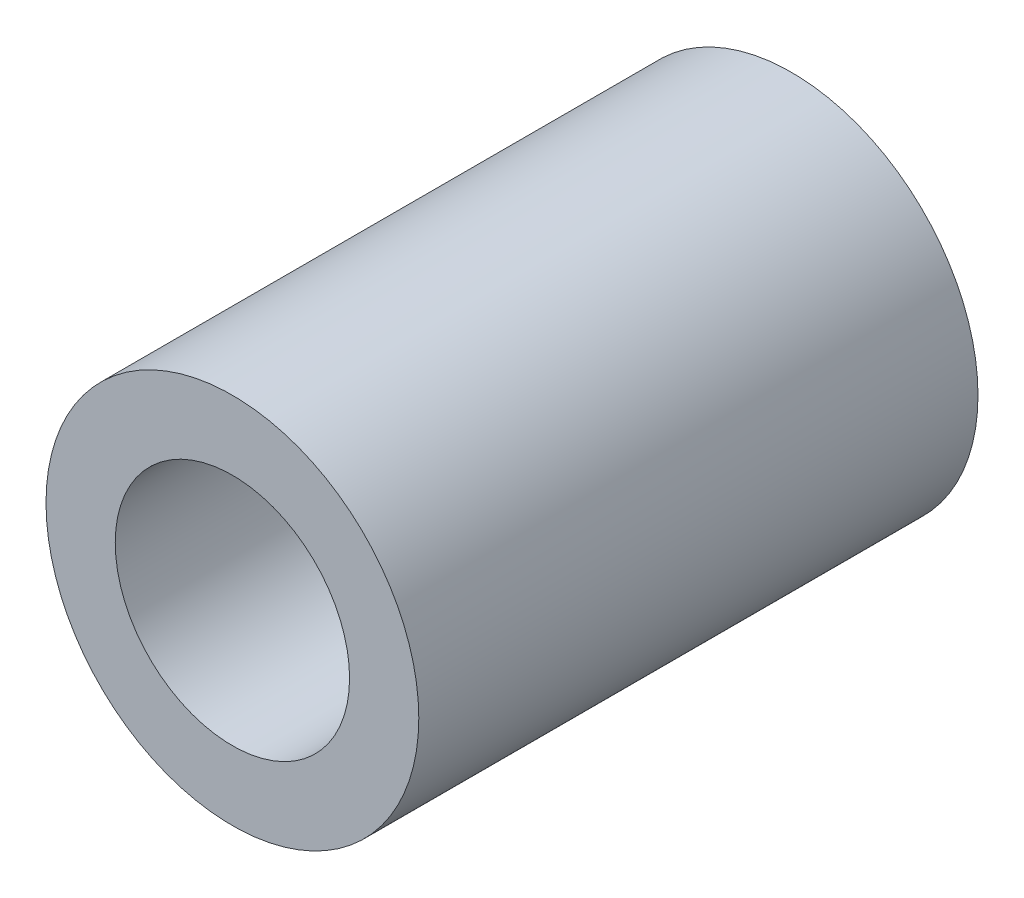
ISO-10303-21;
HEADER;
FILE_DESCRIPTION(('STEP AP214'),'2;1');
FILE_NAME('part.step','',(''),(''),'','','');
FILE_SCHEMA(('AUTOMOTIVE_DESIGN { 1 0 10303 214 1 1 1 1 }'));
ENDSEC;
DATA;
#1=APPLICATION_CONTEXT('core data for automotive mechanical design processes');
#2=APPLICATION_PROTOCOL_DEFINITION('international standard','automotive_design',2000,#1);
#3=PRODUCT_CONTEXT('',#1,'mechanical');
#4=PRODUCT('Part','Part','',(#3));
#5=PRODUCT_RELATED_PRODUCT_CATEGORY('part','',(#4));
#6=PRODUCT_DEFINITION_FORMATION('','',#4);
#7=PRODUCT_DEFINITION_CONTEXT('part definition',#1,'design');
#8=PRODUCT_DEFINITION('design','',#6,#7);
#9=PRODUCT_DEFINITION_SHAPE('','',#8);
#10=(LENGTH_UNIT() NAMED_UNIT(*) SI_UNIT(.MILLI.,.METRE.));
#11=(NAMED_UNIT(*) PLANE_ANGLE_UNIT() SI_UNIT($,.RADIAN.));
#12=(NAMED_UNIT(*) SI_UNIT($,.STERADIAN.) SOLID_ANGLE_UNIT());
#13=UNCERTAINTY_MEASURE_WITH_UNIT(LENGTH_MEASURE(1.E-05),#10,'distance_accuracy_value','');
#14=(GEOMETRIC_REPRESENTATION_CONTEXT(3) GLOBAL_UNCERTAINTY_ASSIGNED_CONTEXT((#13)) GLOBAL_UNIT_ASSIGNED_CONTEXT((#10,
#11,#12)) REPRESENTATION_CONTEXT('',''));
#15=CARTESIAN_POINT('',(0.,0.,0.));
#16=DIRECTION('',(0.,0.,1.));
#17=DIRECTION('',(1.,0.,0.));
#18=AXIS2_PLACEMENT_3D('',#15,#16,#17);
#19=CARTESIAN_POINT('',(0.,0.,21.));
#20=DIRECTION('',(0.,0.,1.));
#21=DIRECTION('',(1.,0.,0.));
#22=AXIS2_PLACEMENT_3D('',#19,#20,#21);
#23=PLANE('',#22);
#24=CARTESIAN_POINT('',(0.,0.,21.));
#25=DIRECTION('',(0.,0.,1.));
#26=DIRECTION('',(1.,0.,0.));
#27=AXIS2_PLACEMENT_3D('',#24,#25,#26);
#28=CIRCLE('',#27,7.);
#29=CARTESIAN_POINT('',(-7.,0.,21.));
#30=VERTEX_POINT('',#29);
#31=EDGE_CURVE('E10',#30,#30,#28,.T.);
#32=ORIENTED_EDGE('',*,*,#31,.T.);
#33=EDGE_LOOP('',(#32));
#34=FACE_BOUND('',#33,.T.);
#35=CARTESIAN_POINT('',(0.,0.,21.));
#36=DIRECTION('',(0.,0.,1.));
#37=DIRECTION('',(1.,0.,0.));
#38=AXIS2_PLACEMENT_3D('',#35,#36,#37);
#39=CIRCLE('',#38,4.4);
#40=CARTESIAN_POINT('',(-4.4,0.,21.));
#41=VERTEX_POINT('',#40);
#42=EDGE_CURVE('E43',#41,#41,#39,.T.);
#43=ORIENTED_EDGE('',*,*,#42,.F.);
#44=EDGE_LOOP('',(#43));
#45=FACE_BOUND('',#44,.T.);
#46=ADVANCED_FACE('F32',(#34,#45),#23,.T.);
#47=CARTESIAN_POINT('',(0.,0.,0.));
#48=DIRECTION('',(0.,0.,1.));
#49=DIRECTION('',(1.,0.,0.));
#50=AXIS2_PLACEMENT_3D('',#47,#48,#49);
#51=PLANE('',#50);
#52=CARTESIAN_POINT('',(0.,0.,0.));
#53=DIRECTION('',(0.,0.,1.));
#54=DIRECTION('',(1.,0.,0.));
#55=AXIS2_PLACEMENT_3D('',#52,#53,#54);
#56=CIRCLE('',#55,7.);
#57=CARTESIAN_POINT('',(-7.,0.,0.));
#58=VERTEX_POINT('',#57);
#59=EDGE_CURVE('E36',#58,#58,#56,.T.);
#60=ORIENTED_EDGE('',*,*,#59,.F.);
#61=EDGE_LOOP('',(#60));
#62=FACE_BOUND('',#61,.T.);
#63=CARTESIAN_POINT('',(0.,0.,0.));
#64=DIRECTION('',(0.,0.,1.));
#65=DIRECTION('',(1.,0.,0.));
#66=AXIS2_PLACEMENT_3D('',#63,#64,#65);
#67=CIRCLE('',#66,4.4);
#68=CARTESIAN_POINT('',(-4.4,0.,0.));
#69=VERTEX_POINT('',#68);
#70=EDGE_CURVE('E45',#69,#69,#67,.T.);
#71=ORIENTED_EDGE('',*,*,#70,.T.);
#72=EDGE_LOOP('',(#71));
#73=FACE_BOUND('',#72,.T.);
#74=ADVANCED_FACE('F55',(#62,#73),#51,.F.);
#75=CARTESIAN_POINT('',(0.,0.,21.));
#76=DIRECTION('',(0.,0.,-1.));
#77=DIRECTION('',(-1.,0.,0.));
#78=AXIS2_PLACEMENT_3D('',#75,#76,#77);
#79=CYLINDRICAL_SURFACE('',#78,7.);
#80=CARTESIAN_POINT('',(-7.,0.,21.));
#81=CARTESIAN_POINT('',(-7.,0.,20.78125));
#82=CARTESIAN_POINT('',(-7.,0.,20.5625));
#83=CARTESIAN_POINT('',(-7.,0.,20.125));
#84=CARTESIAN_POINT('',(-7.,0.,19.90625));
#85=CARTESIAN_POINT('',(-7.,0.,19.46875));
#86=CARTESIAN_POINT('',(-7.,0.,19.25));
#87=CARTESIAN_POINT('',(-7.,0.,18.8125));
#88=CARTESIAN_POINT('',(-7.,0.,18.59375));
#89=CARTESIAN_POINT('',(-7.,0.,18.15625));
#90=CARTESIAN_POINT('',(-7.,0.,17.9375));
#91=CARTESIAN_POINT('',(-7.,0.,17.5));
#92=CARTESIAN_POINT('',(-7.,0.,17.28125));
#93=CARTESIAN_POINT('',(-7.,0.,16.84375));
#94=CARTESIAN_POINT('',(-7.,0.,16.625));
#95=CARTESIAN_POINT('',(-7.,0.,16.1875));
#96=CARTESIAN_POINT('',(-7.,0.,15.96875));
#97=CARTESIAN_POINT('',(-7.,0.,15.53125));
#98=CARTESIAN_POINT('',(-7.,0.,15.3125));
#99=CARTESIAN_POINT('',(-7.,0.,14.875));
#100=CARTESIAN_POINT('',(-7.,0.,14.65625));
#101=CARTESIAN_POINT('',(-7.,0.,14.21875));
#102=CARTESIAN_POINT('',(-7.,0.,14.));
#103=CARTESIAN_POINT('',(-7.,0.,13.5625));
#104=CARTESIAN_POINT('',(-7.,0.,13.34375));
#105=CARTESIAN_POINT('',(-7.,0.,12.90625));
#106=CARTESIAN_POINT('',(-7.,0.,12.6875));
#107=CARTESIAN_POINT('',(-7.,0.,12.25));
#108=CARTESIAN_POINT('',(-7.,0.,12.03125));
#109=CARTESIAN_POINT('',(-7.,0.,11.59375));
#110=CARTESIAN_POINT('',(-7.,0.,11.375));
#111=CARTESIAN_POINT('',(-7.,0.,10.9375));
#112=CARTESIAN_POINT('',(-7.,0.,10.71875));
#113=CARTESIAN_POINT('',(-7.,0.,10.28125));
#114=CARTESIAN_POINT('',(-7.,0.,10.0625));
#115=CARTESIAN_POINT('',(-7.,0.,9.625));
#116=CARTESIAN_POINT('',(-7.,0.,9.40625));
#117=CARTESIAN_POINT('',(-7.,0.,8.96875));
#118=CARTESIAN_POINT('',(-7.,0.,8.75));
#119=CARTESIAN_POINT('',(-7.,0.,8.3125));
#120=CARTESIAN_POINT('',(-7.,0.,8.09375));
#121=CARTESIAN_POINT('',(-7.,0.,7.65625));
#122=CARTESIAN_POINT('',(-7.,0.,7.4375));
#123=CARTESIAN_POINT('',(-7.,0.,7.));
#124=CARTESIAN_POINT('',(-7.,0.,6.78125));
#125=CARTESIAN_POINT('',(-7.,0.,6.34375));
#126=CARTESIAN_POINT('',(-7.,0.,6.125));
#127=CARTESIAN_POINT('',(-7.,0.,5.6875));
#128=CARTESIAN_POINT('',(-7.,0.,5.46875));
#129=CARTESIAN_POINT('',(-7.,0.,5.03125));
#130=CARTESIAN_POINT('',(-7.,0.,4.8125));
#131=CARTESIAN_POINT('',(-7.,0.,4.375));
#132=CARTESIAN_POINT('',(-7.,0.,4.15625));
#133=CARTESIAN_POINT('',(-7.,0.,3.71875));
#134=CARTESIAN_POINT('',(-7.,0.,3.5));
#135=CARTESIAN_POINT('',(-7.,0.,3.0625));
#136=CARTESIAN_POINT('',(-7.,0.,2.84375));
#137=CARTESIAN_POINT('',(-7.,0.,2.40625));
#138=CARTESIAN_POINT('',(-7.,0.,2.1875));
#139=CARTESIAN_POINT('',(-7.,0.,1.75));
#140=CARTESIAN_POINT('',(-7.,0.,1.53125));
#141=CARTESIAN_POINT('',(-7.,0.,1.09375));
#142=CARTESIAN_POINT('',(-7.,0.,0.875000000000001));
#143=CARTESIAN_POINT('',(-7.,0.,0.4375));
#144=CARTESIAN_POINT('',(-7.,0.,0.21875));
#145=CARTESIAN_POINT('',(-7.,0.,0.));
#146=B_SPLINE_CURVE_WITH_KNOTS('',3,(#80,#81,#82,#83,#84,#85,#86,#87,#88,#89,#90,#91,#92,#93,
#94,#95,#96,#97,#98,#99,#100,#101,#102,#103,#104,#105,#106,#107,#108,#109,#110,#111,#112,#113,
#114,#115,#116,#117,#118,#119,#120,#121,#122,#123,#124,#125,#126,#127,#128,#129,#130,#131,#132,
#133,#134,#135,#136,#137,#138,#139,#140,#141,#142,#143,#144,#145),.UNSPECIFIED.,.F.,.F.,(4,2,2,
2,2,2,2,2,2,2,2,2,2,2,2,2,2,2,2,2,2,2,2,2,2,2,2,2,2,2,2,2,4),(0.,0.656249999999997,1.3125,
1.96875,2.625,3.28125,3.9375,4.59375,5.25,5.90625,6.5625,7.21875,7.875,8.53125,9.1875,9.84375,
10.5,11.15625,11.8125,12.46875,13.125,13.78125,14.4375,15.09375,15.75,16.40625,17.0625,17.71875,
18.375,19.03125,19.6875,20.34375,21.),.UNSPECIFIED.);
#147=EDGE_CURVE('BSEAM34',#30,#58,#146,.T.);
#148=ORIENTED_EDGE('',*,*,#31,.F.);
#149=ORIENTED_EDGE('',*,*,#59,.T.);
#150=ORIENTED_EDGE('',*,*,#147,.T.);
#151=ORIENTED_EDGE('',*,*,#147,.F.);
#152=EDGE_LOOP('',(#148,#150,#149,#151));
#153=FACE_BOUND('',#152,.T.);
#154=ADVANCED_FACE('F34',(#153),#79,.T.);
#155=CARTESIAN_POINT('',(0.,0.,21.));
#156=DIRECTION('',(0.,0.,-1.));
#157=DIRECTION('',(-1.,0.,0.));
#158=AXIS2_PLACEMENT_3D('',#155,#156,#157);
#159=CYLINDRICAL_SURFACE('',#158,4.4);
#160=CARTESIAN_POINT('',(-4.4,0.,21.));
#161=CARTESIAN_POINT('',(-4.4,0.,20.78125));
#162=CARTESIAN_POINT('',(-4.4,0.,20.5625));
#163=CARTESIAN_POINT('',(-4.4,0.,20.125));
#164=CARTESIAN_POINT('',(-4.4,0.,19.90625));
#165=CARTESIAN_POINT('',(-4.4,0.,19.46875));
#166=CARTESIAN_POINT('',(-4.4,0.,19.25));
#167=CARTESIAN_POINT('',(-4.4,0.,18.8125));
#168=CARTESIAN_POINT('',(-4.4,0.,18.59375));
#169=CARTESIAN_POINT('',(-4.4,0.,18.15625));
#170=CARTESIAN_POINT('',(-4.4,0.,17.9375));
#171=CARTESIAN_POINT('',(-4.4,0.,17.5));
#172=CARTESIAN_POINT('',(-4.4,0.,17.28125));
#173=CARTESIAN_POINT('',(-4.4,0.,16.84375));
#174=CARTESIAN_POINT('',(-4.4,0.,16.625));
#175=CARTESIAN_POINT('',(-4.4,0.,16.1875));
#176=CARTESIAN_POINT('',(-4.4,0.,15.96875));
#177=CARTESIAN_POINT('',(-4.4,0.,15.53125));
#178=CARTESIAN_POINT('',(-4.4,0.,15.3125));
#179=CARTESIAN_POINT('',(-4.4,0.,14.875));
#180=CARTESIAN_POINT('',(-4.4,0.,14.65625));
#181=CARTESIAN_POINT('',(-4.4,0.,14.21875));
#182=CARTESIAN_POINT('',(-4.4,0.,14.));
#183=CARTESIAN_POINT('',(-4.4,0.,13.5625));
#184=CARTESIAN_POINT('',(-4.4,0.,13.34375));
#185=CARTESIAN_POINT('',(-4.4,0.,12.90625));
#186=CARTESIAN_POINT('',(-4.4,0.,12.6875));
#187=CARTESIAN_POINT('',(-4.4,0.,12.25));
#188=CARTESIAN_POINT('',(-4.4,0.,12.03125));
#189=CARTESIAN_POINT('',(-4.4,0.,11.59375));
#190=CARTESIAN_POINT('',(-4.4,0.,11.375));
#191=CARTESIAN_POINT('',(-4.4,0.,10.9375));
#192=CARTESIAN_POINT('',(-4.4,0.,10.71875));
#193=CARTESIAN_POINT('',(-4.4,0.,10.28125));
#194=CARTESIAN_POINT('',(-4.4,0.,10.0625));
#195=CARTESIAN_POINT('',(-4.4,0.,9.625));
#196=CARTESIAN_POINT('',(-4.4,0.,9.40625));
#197=CARTESIAN_POINT('',(-4.4,0.,8.96875));
#198=CARTESIAN_POINT('',(-4.4,0.,8.75));
#199=CARTESIAN_POINT('',(-4.4,0.,8.3125));
#200=CARTESIAN_POINT('',(-4.4,0.,8.09375));
#201=CARTESIAN_POINT('',(-4.4,0.,7.65625));
#202=CARTESIAN_POINT('',(-4.4,0.,7.4375));
#203=CARTESIAN_POINT('',(-4.4,0.,7.));
#204=CARTESIAN_POINT('',(-4.4,0.,6.78125));
#205=CARTESIAN_POINT('',(-4.4,0.,6.34375));
#206=CARTESIAN_POINT('',(-4.4,0.,6.125));
#207=CARTESIAN_POINT('',(-4.4,0.,5.6875));
#208=CARTESIAN_POINT('',(-4.4,0.,5.46875));
#209=CARTESIAN_POINT('',(-4.4,0.,5.03125));
#210=CARTESIAN_POINT('',(-4.4,0.,4.8125));
#211=CARTESIAN_POINT('',(-4.4,0.,4.375));
#212=CARTESIAN_POINT('',(-4.4,0.,4.15625));
#213=CARTESIAN_POINT('',(-4.4,0.,3.71875));
#214=CARTESIAN_POINT('',(-4.4,0.,3.5));
#215=CARTESIAN_POINT('',(-4.4,0.,3.0625));
#216=CARTESIAN_POINT('',(-4.4,0.,2.84375));
#217=CARTESIAN_POINT('',(-4.4,0.,2.40625));
#218=CARTESIAN_POINT('',(-4.4,0.,2.1875));
#219=CARTESIAN_POINT('',(-4.4,0.,1.75));
#220=CARTESIAN_POINT('',(-4.4,0.,1.53125));
#221=CARTESIAN_POINT('',(-4.4,0.,1.09375));
#222=CARTESIAN_POINT('',(-4.4,0.,0.875000000000001));
#223=CARTESIAN_POINT('',(-4.4,0.,0.4375));
#224=CARTESIAN_POINT('',(-4.4,0.,0.21875));
#225=CARTESIAN_POINT('',(-4.4,0.,0.));
#226=B_SPLINE_CURVE_WITH_KNOTS('',3,(#160,#161,#162,#163,#164,#165,#166,#167,#168,#169,#170,
#171,#172,#173,#174,#175,#176,#177,#178,#179,#180,#181,#182,#183,#184,#185,#186,#187,#188,#189,
#190,#191,#192,#193,#194,#195,#196,#197,#198,#199,#200,#201,#202,#203,#204,#205,#206,#207,#208,
#209,#210,#211,#212,#213,#214,#215,#216,#217,#218,#219,#220,#221,#222,#223,#224,#225),
.UNSPECIFIED.,.F.,.F.,(4,2,2,2,2,2,2,2,2,2,2,2,2,2,2,2,2,2,2,2,2,2,2,2,2,2,2,2,2,2,2,2,4),(0.,
0.656250000000001,1.3125,1.96875,2.625,3.28125,3.9375,4.59375,5.25,5.90625,6.5625,7.21875,7.875,
8.53125,9.1875,9.84375,10.5,11.15625,11.8125,12.46875,13.125,13.78125,14.4375,15.09375,15.75,
16.40625,17.0625,17.71875,18.375,19.03125,19.6875,20.34375,21.),.UNSPECIFIED.);
#227=EDGE_CURVE('BSEAM51',#41,#69,#226,.T.);
#228=ORIENTED_EDGE('',*,*,#42,.T.);
#229=ORIENTED_EDGE('',*,*,#70,.F.);
#230=ORIENTED_EDGE('',*,*,#227,.T.);
#231=ORIENTED_EDGE('',*,*,#227,.F.);
#232=EDGE_LOOP('',(#228,#230,#229,#231));
#233=FACE_BOUND('',#232,.T.);
#234=ADVANCED_FACE('F51',(#233),#159,.F.);
#235=CLOSED_SHELL('',(#46,#74,#154,#234));
#236=MANIFOLD_SOLID_BREP('B2',#235);
#237=ADVANCED_BREP_SHAPE_REPRESENTATION('',(#18,#236),#14);
#238=SHAPE_DEFINITION_REPRESENTATION(#9,#237);
ENDSEC;
END-ISO-10303-21;
